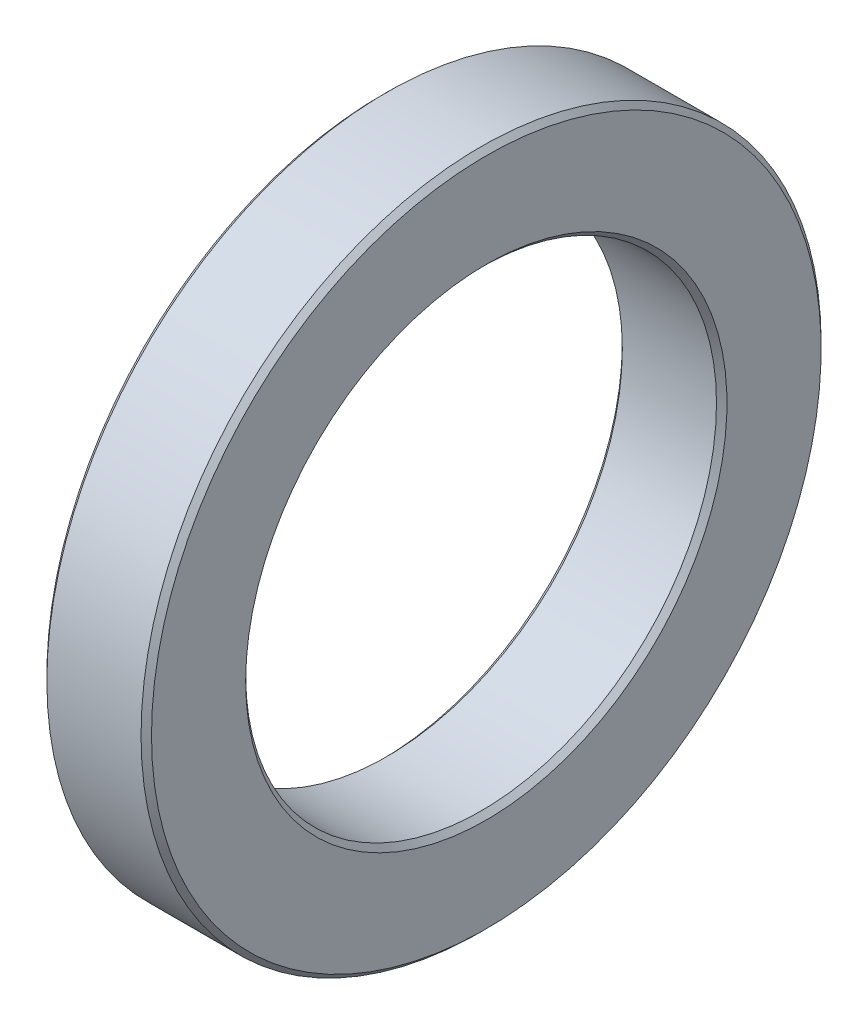
ISO-10303-21;
HEADER;
FILE_DESCRIPTION(('STEP AP214'),'2;1');
FILE_NAME('part.step','',(''),(''),'','','');
FILE_SCHEMA(('AUTOMOTIVE_DESIGN { 1 0 10303 214 1 1 1 1 }'));
ENDSEC;
DATA;
#1=APPLICATION_CONTEXT('core data for automotive mechanical design processes');
#2=APPLICATION_PROTOCOL_DEFINITION('international standard','automotive_design',2000,#1);
#3=PRODUCT_CONTEXT('',#1,'mechanical');
#4=PRODUCT('Part','Part','',(#3));
#5=PRODUCT_RELATED_PRODUCT_CATEGORY('part','',(#4));
#6=PRODUCT_DEFINITION_FORMATION('','',#4);
#7=PRODUCT_DEFINITION_CONTEXT('part definition',#1,'design');
#8=PRODUCT_DEFINITION('design','',#6,#7);
#9=PRODUCT_DEFINITION_SHAPE('','',#8);
#10=(LENGTH_UNIT() NAMED_UNIT(*) SI_UNIT(.MILLI.,.METRE.));
#11=(NAMED_UNIT(*) PLANE_ANGLE_UNIT() SI_UNIT($,.RADIAN.));
#12=(NAMED_UNIT(*) SI_UNIT($,.STERADIAN.) SOLID_ANGLE_UNIT());
#13=UNCERTAINTY_MEASURE_WITH_UNIT(LENGTH_MEASURE(1.E-05),#10,'distance_accuracy_value','');
#14=(GEOMETRIC_REPRESENTATION_CONTEXT(3) GLOBAL_UNCERTAINTY_ASSIGNED_CONTEXT((#13)) GLOBAL_UNIT_ASSIGNED_CONTEXT((#10,
#11,#12)) REPRESENTATION_CONTEXT('',''));
#15=CARTESIAN_POINT('',(0.,0.,0.));
#16=DIRECTION('',(0.,0.,1.));
#17=DIRECTION('',(1.,0.,0.));
#18=AXIS2_PLACEMENT_3D('',#15,#16,#17);
#19=CARTESIAN_POINT('',(0.,32.5,0.));
#20=DIRECTION('',(1.,0.,0.));
#21=DIRECTION('',(0.,0.,-1.));
#22=AXIS2_PLACEMENT_3D('',#19,#20,#21);
#23=PLANE('',#22);
#24=CARTESIAN_POINT('',(0.,0.,0.));
#25=DIRECTION('',(1.,0.,0.));
#26=DIRECTION('',(0.,0.,-1.));
#27=AXIS2_PLACEMENT_3D('',#24,#25,#26);
#28=CIRCLE('',#27,23.);
#29=CARTESIAN_POINT('',(0.,0.,-23.));
#30=VERTEX_POINT('',#29);
#31=EDGE_CURVE('E68',#30,#30,#28,.T.);
#32=ORIENTED_EDGE('',*,*,#31,.T.);
#33=EDGE_LOOP('',(#32));
#34=FACE_BOUND('',#33,.T.);
#35=CARTESIAN_POINT('',(0.,0.,0.));
#36=DIRECTION('',(1.,0.,0.));
#37=DIRECTION('',(0.,0.,-1.));
#38=AXIS2_PLACEMENT_3D('',#35,#36,#37);
#39=CIRCLE('',#38,32.);
#40=CARTESIAN_POINT('',(0.,0.,-32.));
#41=VERTEX_POINT('',#40);
#42=EDGE_CURVE('E72',#41,#41,#39,.F.);
#43=ORIENTED_EDGE('',*,*,#42,.T.);
#44=EDGE_LOOP('',(#43));
#45=FACE_BOUND('',#44,.T.);
#46=ADVANCED_FACE('F43',(#34,#45),#23,.F.);
#47=CARTESIAN_POINT('',(0.,0.,0.));
#48=DIRECTION('',(-1.,0.,0.));
#49=DIRECTION('',(0.,0.,1.));
#50=AXIS2_PLACEMENT_3D('',#47,#48,#49);
#51=CYLINDRICAL_SURFACE('',#50,22.5);
#52=CARTESIAN_POINT('',(0.499999999999989,0.,0.));
#53=DIRECTION('',(1.,0.,0.));
#54=DIRECTION('',(0.,0.,-1.));
#55=AXIS2_PLACEMENT_3D('',#52,#53,#54);
#56=CIRCLE('',#55,22.5);
#57=CARTESIAN_POINT('',(0.499999999999989,0.,-22.5));
#58=VERTEX_POINT('',#57);
#59=EDGE_CURVE('E76',#58,#58,#56,.F.);
#60=ORIENTED_EDGE('',*,*,#59,.T.);
#61=EDGE_LOOP('',(#60));
#62=FACE_BOUND('',#61,.T.);
#63=CARTESIAN_POINT('',(9.49999999999998,0.,0.));
#64=DIRECTION('',(-1.,0.,0.));
#65=DIRECTION('',(0.,0.,1.));
#66=AXIS2_PLACEMENT_3D('',#63,#64,#65);
#67=CIRCLE('',#66,22.5);
#68=CARTESIAN_POINT('',(9.49999999999998,0.,22.5));
#69=VERTEX_POINT('',#68);
#70=EDGE_CURVE('E80',#69,#69,#67,.F.);
#71=ORIENTED_EDGE('',*,*,#70,.T.);
#72=EDGE_LOOP('',(#71));
#73=FACE_BOUND('',#72,.T.);
#74=ADVANCED_FACE('F85',(#62,#73),#51,.F.);
#75=CARTESIAN_POINT('',(10.,32.5,0.));
#76=DIRECTION('',(-1.,0.,0.));
#77=DIRECTION('',(0.,0.,1.));
#78=AXIS2_PLACEMENT_3D('',#75,#76,#77);
#79=PLANE('',#78);
#80=CARTESIAN_POINT('',(10.,0.,0.));
#81=DIRECTION('',(-1.,0.,0.));
#82=DIRECTION('',(0.,0.,1.));
#83=AXIS2_PLACEMENT_3D('',#80,#81,#82);
#84=CIRCLE('',#83,23.);
#85=CARTESIAN_POINT('',(10.,0.,23.));
#86=VERTEX_POINT('',#85);
#87=EDGE_CURVE('E57',#86,#86,#84,.T.);
#88=ORIENTED_EDGE('',*,*,#87,.T.);
#89=EDGE_LOOP('',(#88));
#90=FACE_BOUND('',#89,.T.);
#91=CARTESIAN_POINT('',(10.,0.,0.));
#92=DIRECTION('',(-1.,0.,0.));
#93=DIRECTION('',(0.,0.,1.));
#94=AXIS2_PLACEMENT_3D('',#91,#92,#93);
#95=CIRCLE('',#94,32.);
#96=CARTESIAN_POINT('',(10.,0.,32.));
#97=VERTEX_POINT('',#96);
#98=EDGE_CURVE('E62',#97,#97,#95,.F.);
#99=ORIENTED_EDGE('',*,*,#98,.T.);
#100=EDGE_LOOP('',(#99));
#101=FACE_BOUND('',#100,.T.);
#102=ADVANCED_FACE('F95',(#90,#101),#79,.F.);
#103=CARTESIAN_POINT('',(0.,0.,0.));
#104=DIRECTION('',(-1.,0.,0.));
#105=DIRECTION('',(0.,0.,1.));
#106=AXIS2_PLACEMENT_3D('',#103,#104,#105);
#107=CYLINDRICAL_SURFACE('',#106,32.5);
#108=CARTESIAN_POINT('',(0.500000000000014,0.,0.));
#109=DIRECTION('',(1.,0.,0.));
#110=DIRECTION('',(0.,0.,-1.));
#111=AXIS2_PLACEMENT_3D('',#108,#109,#110);
#112=CIRCLE('',#111,32.5);
#113=CARTESIAN_POINT('',(0.500000000000014,0.,-32.5));
#114=VERTEX_POINT('',#113);
#115=EDGE_CURVE('E10',#114,#114,#112,.T.);
#116=ORIENTED_EDGE('',*,*,#115,.T.);
#117=EDGE_LOOP('',(#116));
#118=FACE_BOUND('',#117,.T.);
#119=CARTESIAN_POINT('',(9.49999999999999,0.,0.));
#120=DIRECTION('',(-1.,0.,0.));
#121=DIRECTION('',(0.,0.,1.));
#122=AXIS2_PLACEMENT_3D('',#119,#120,#121);
#123=CIRCLE('',#122,32.5);
#124=CARTESIAN_POINT('',(9.49999999999999,0.,32.5));
#125=VERTEX_POINT('',#124);
#126=EDGE_CURVE('E52',#125,#125,#123,.T.);
#127=ORIENTED_EDGE('',*,*,#126,.T.);
#128=EDGE_LOOP('',(#127));
#129=FACE_BOUND('',#128,.T.);
#130=ADVANCED_FACE('F98',(#118,#129),#107,.T.);
#131=CARTESIAN_POINT('',(0.499999999999989,0.,0.));
#132=DIRECTION('',(-1.,0.,0.));
#133=DIRECTION('',(0.,0.,1.));
#134=AXIS2_PLACEMENT_3D('',#131,#132,#133);
#135=CONICAL_SURFACE('',#134,22.5,0.785398163397452);
#136=ORIENTED_EDGE('',*,*,#31,.F.);
#137=EDGE_LOOP('',(#136));
#138=FACE_BOUND('',#137,.T.);
#139=ORIENTED_EDGE('',*,*,#59,.F.);
#140=EDGE_LOOP('',(#139));
#141=FACE_BOUND('',#140,.T.);
#142=ADVANCED_FACE('F91',(#138,#141),#135,.F.);
#143=CARTESIAN_POINT('',(10.,0.,0.));
#144=DIRECTION('',(1.,0.,0.));
#145=DIRECTION('',(0.,0.,-1.));
#146=AXIS2_PLACEMENT_3D('',#143,#144,#145);
#147=CONICAL_SURFACE('',#146,23.,0.785398163397441);
#148=ORIENTED_EDGE('',*,*,#70,.F.);
#149=EDGE_LOOP('',(#148));
#150=FACE_BOUND('',#149,.T.);
#151=ORIENTED_EDGE('',*,*,#87,.F.);
#152=EDGE_LOOP('',(#151));
#153=FACE_BOUND('',#152,.T.);
#154=ADVANCED_FACE('F87',(#150,#153),#147,.F.);
#155=CARTESIAN_POINT('',(0.,0.,0.));
#156=DIRECTION('',(1.,0.,0.));
#157=DIRECTION('',(0.,0.,-1.));
#158=AXIS2_PLACEMENT_3D('',#155,#156,#157);
#159=CONICAL_SURFACE('',#158,32.,0.785398163397435);
#160=ORIENTED_EDGE('',*,*,#115,.F.);
#161=EDGE_LOOP('',(#160));
#162=FACE_BOUND('',#161,.T.);
#163=ORIENTED_EDGE('',*,*,#42,.F.);
#164=EDGE_LOOP('',(#163));
#165=FACE_BOUND('',#164,.T.);
#166=ADVANCED_FACE('F90',(#162,#165),#159,.T.);
#167=CARTESIAN_POINT('',(9.49999999999999,0.,0.));
#168=DIRECTION('',(-1.,0.,0.));
#169=DIRECTION('',(0.,0.,1.));
#170=AXIS2_PLACEMENT_3D('',#167,#168,#169);
#171=CONICAL_SURFACE('',#170,32.5,0.785398163397455);
#172=ORIENTED_EDGE('',*,*,#98,.F.);
#173=EDGE_LOOP('',(#172));
#174=FACE_BOUND('',#173,.T.);
#175=ORIENTED_EDGE('',*,*,#126,.F.);
#176=EDGE_LOOP('',(#175));
#177=FACE_BOUND('',#176,.T.);
#178=ADVANCED_FACE('F46',(#174,#177),#171,.T.);
#179=CLOSED_SHELL('',(#46,#74,#102,#130,#142,#154,#166,#178));
#180=MANIFOLD_SOLID_BREP('B2',#179);
#181=ADVANCED_BREP_SHAPE_REPRESENTATION('',(#18,#180),#14);
#182=SHAPE_DEFINITION_REPRESENTATION(#9,#181);
ENDSEC;
END-ISO-10303-21;
